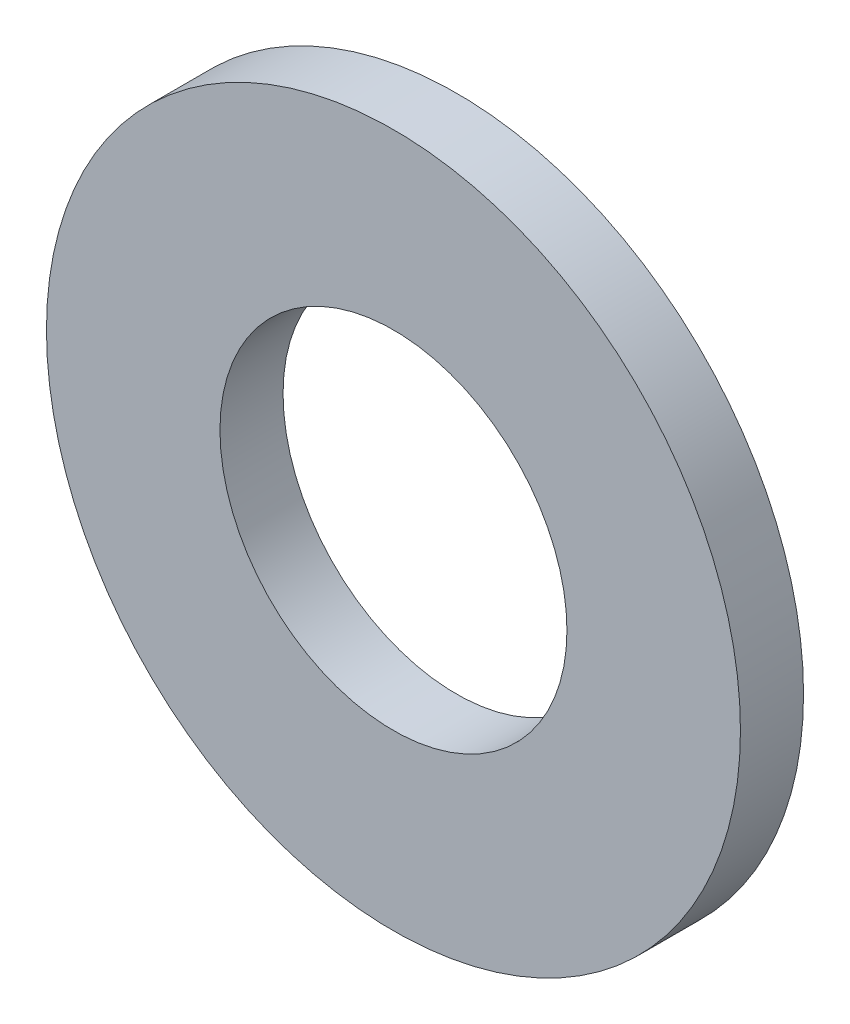
ISO-10303-21;
HEADER;
FILE_DESCRIPTION(('STEP AP214'),'2;1');
FILE_NAME('part.step','',(''),(''),'','','');
FILE_SCHEMA(('AUTOMOTIVE_DESIGN { 1 0 10303 214 1 1 1 1 }'));
ENDSEC;
DATA;
#1=APPLICATION_CONTEXT('core data for automotive mechanical design processes');
#2=APPLICATION_PROTOCOL_DEFINITION('international standard','automotive_design',2000,#1);
#3=PRODUCT_CONTEXT('',#1,'mechanical');
#4=PRODUCT('Part','Part','',(#3));
#5=PRODUCT_RELATED_PRODUCT_CATEGORY('part','',(#4));
#6=PRODUCT_DEFINITION_FORMATION('','',#4);
#7=PRODUCT_DEFINITION_CONTEXT('part definition',#1,'design');
#8=PRODUCT_DEFINITION('design','',#6,#7);
#9=PRODUCT_DEFINITION_SHAPE('','',#8);
#10=(LENGTH_UNIT() NAMED_UNIT(*) SI_UNIT(.MILLI.,.METRE.));
#11=(NAMED_UNIT(*) PLANE_ANGLE_UNIT() SI_UNIT($,.RADIAN.));
#12=(NAMED_UNIT(*) SI_UNIT($,.STERADIAN.) SOLID_ANGLE_UNIT());
#13=UNCERTAINTY_MEASURE_WITH_UNIT(LENGTH_MEASURE(1.E-05),#10,'distance_accuracy_value','');
#14=(GEOMETRIC_REPRESENTATION_CONTEXT(3) GLOBAL_UNCERTAINTY_ASSIGNED_CONTEXT((#13)) GLOBAL_UNIT_ASSIGNED_CONTEXT((#10,
#11,#12)) REPRESENTATION_CONTEXT('',''));
#15=CARTESIAN_POINT('',(0.,0.,0.));
#16=DIRECTION('',(0.,0.,1.));
#17=DIRECTION('',(1.,0.,0.));
#18=AXIS2_PLACEMENT_3D('',#15,#16,#17);
#19=CARTESIAN_POINT('',(0.,0.,1.5875));
#20=DIRECTION('',(0.,0.,1.));
#21=DIRECTION('',(1.,0.,0.));
#22=AXIS2_PLACEMENT_3D('',#19,#20,#21);
#23=PLANE('',#22);
#24=CARTESIAN_POINT('',(0.,0.,1.5875));
#25=DIRECTION('',(0.,0.,1.));
#26=DIRECTION('',(1.,0.,0.));
#27=AXIS2_PLACEMENT_3D('',#24,#25,#26);
#28=CIRCLE('',#27,8.73125);
#29=CARTESIAN_POINT('',(8.73125,0.,1.5875));
#30=VERTEX_POINT('',#29);
#31=EDGE_CURVE('E10',#30,#30,#28,.T.);
#32=ORIENTED_EDGE('',*,*,#31,.T.);
#33=EDGE_LOOP('',(#32));
#34=FACE_BOUND('',#33,.T.);
#35=CARTESIAN_POINT('',(0.,0.,1.5875));
#36=DIRECTION('',(0.,0.,1.));
#37=DIRECTION('',(1.,0.,0.));
#38=AXIS2_PLACEMENT_3D('',#35,#36,#37);
#39=CIRCLE('',#38,4.365625);
#40=CARTESIAN_POINT('',(4.365625,0.,1.5875));
#41=VERTEX_POINT('',#40);
#42=EDGE_CURVE('E56',#41,#41,#39,.T.);
#43=ORIENTED_EDGE('',*,*,#42,.F.);
#44=EDGE_LOOP('',(#43));
#45=FACE_BOUND('',#44,.T.);
#46=ADVANCED_FACE('F43',(#34,#45),#23,.T.);
#47=CARTESIAN_POINT('',(0.,0.,0.));
#48=DIRECTION('',(0.,0.,1.));
#49=DIRECTION('',(1.,0.,0.));
#50=AXIS2_PLACEMENT_3D('',#47,#48,#49);
#51=PLANE('',#50);
#52=CARTESIAN_POINT('',(0.,0.,0.));
#53=DIRECTION('',(0.,0.,1.));
#54=DIRECTION('',(1.,0.,0.));
#55=AXIS2_PLACEMENT_3D('',#52,#53,#54);
#56=CIRCLE('',#55,8.73125);
#57=CARTESIAN_POINT('',(8.73125,0.,0.));
#58=VERTEX_POINT('',#57);
#59=EDGE_CURVE('E47',#58,#58,#56,.T.);
#60=ORIENTED_EDGE('',*,*,#59,.F.);
#61=EDGE_LOOP('',(#60));
#62=FACE_BOUND('',#61,.T.);
#63=CARTESIAN_POINT('',(0.,0.,0.));
#64=DIRECTION('',(0.,0.,1.));
#65=DIRECTION('',(1.,0.,0.));
#66=AXIS2_PLACEMENT_3D('',#63,#64,#65);
#67=CIRCLE('',#66,4.365625);
#68=CARTESIAN_POINT('',(4.365625,0.,0.));
#69=VERTEX_POINT('',#68);
#70=EDGE_CURVE('E58',#69,#69,#67,.T.);
#71=ORIENTED_EDGE('',*,*,#70,.T.);
#72=EDGE_LOOP('',(#71));
#73=FACE_BOUND('',#72,.T.);
#74=ADVANCED_FACE('F70',(#62,#73),#51,.F.);
#75=CARTESIAN_POINT('',(0.,0.,1.5875));
#76=DIRECTION('',(0.,0.,-1.));
#77=DIRECTION('',(-1.,0.,0.));
#78=AXIS2_PLACEMENT_3D('',#75,#76,#77);
#79=CYLINDRICAL_SURFACE('',#78,8.73125);
#80=ORIENTED_EDGE('',*,*,#31,.F.);
#81=EDGE_LOOP('',(#80));
#82=FACE_BOUND('',#81,.T.);
#83=ORIENTED_EDGE('',*,*,#59,.T.);
#84=EDGE_LOOP('',(#83));
#85=FACE_BOUND('',#84,.T.);
#86=ADVANCED_FACE('F45',(#82,#85),#79,.T.);
#87=CARTESIAN_POINT('',(0.,0.,1.5875));
#88=DIRECTION('',(0.,0.,-1.));
#89=DIRECTION('',(-1.,0.,0.));
#90=AXIS2_PLACEMENT_3D('',#87,#88,#89);
#91=CYLINDRICAL_SURFACE('',#90,4.365625);
#92=ORIENTED_EDGE('',*,*,#42,.T.);
#93=EDGE_LOOP('',(#92));
#94=FACE_BOUND('',#93,.T.);
#95=ORIENTED_EDGE('',*,*,#70,.F.);
#96=EDGE_LOOP('',(#95));
#97=FACE_BOUND('',#96,.T.);
#98=ADVANCED_FACE('F66',(#94,#97),#91,.F.);
#99=CLOSED_SHELL('',(#46,#74,#86,#98));
#100=MANIFOLD_SOLID_BREP('B2',#99);
#101=ADVANCED_BREP_SHAPE_REPRESENTATION('',(#18,#100),#14);
#102=SHAPE_DEFINITION_REPRESENTATION(#9,#101);
ENDSEC;
END-ISO-10303-21;
